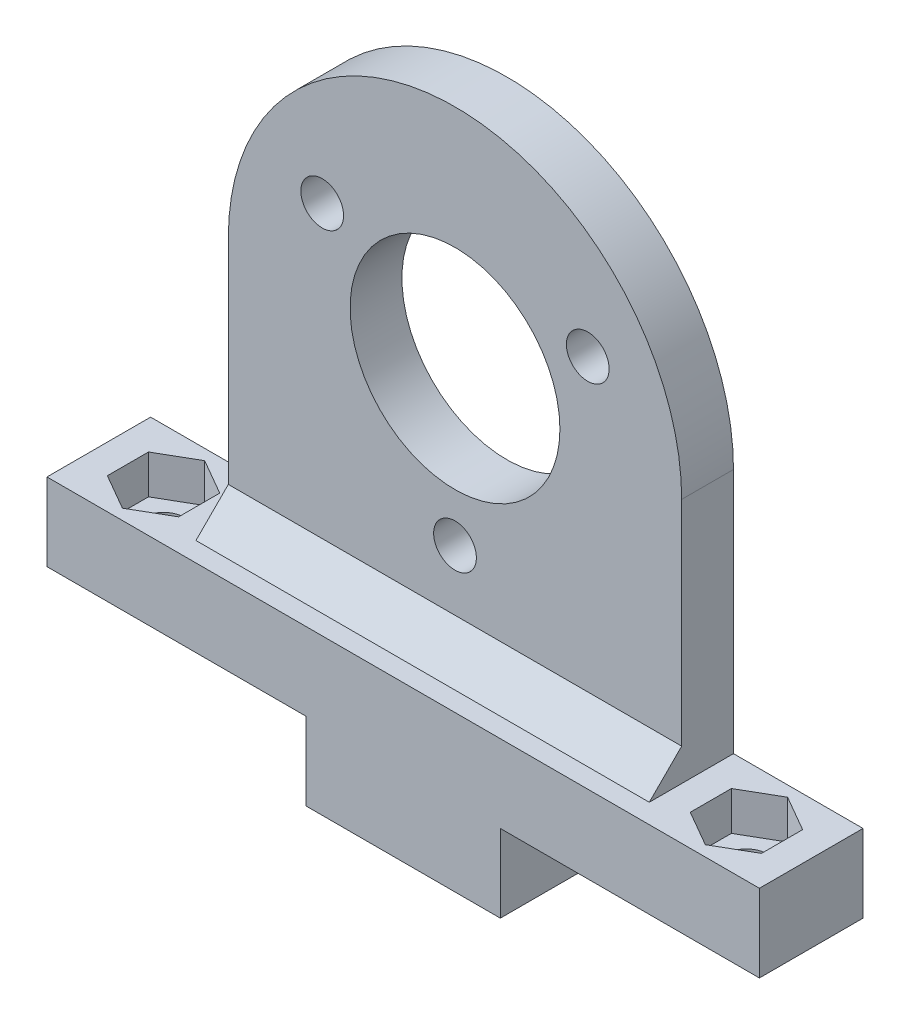
ISO-10303-21;
HEADER;
FILE_DESCRIPTION(('STEP AP214'),'2;1');
FILE_NAME('part.step','',(''),(''),'','','');
FILE_SCHEMA(('AUTOMOTIVE_DESIGN { 1 0 10303 214 1 1 1 1 }'));
ENDSEC;
DATA;
#1=APPLICATION_CONTEXT('core data for automotive mechanical design processes');
#2=APPLICATION_PROTOCOL_DEFINITION('international standard','automotive_design',2000,#1);
#3=PRODUCT_CONTEXT('',#1,'mechanical');
#4=PRODUCT('Part','Part','',(#3));
#5=PRODUCT_RELATED_PRODUCT_CATEGORY('part','',(#4));
#6=PRODUCT_DEFINITION_FORMATION('','',#4);
#7=PRODUCT_DEFINITION_CONTEXT('part definition',#1,'design');
#8=PRODUCT_DEFINITION('design','',#6,#7);
#9=PRODUCT_DEFINITION_SHAPE('','',#8);
#10=(LENGTH_UNIT() NAMED_UNIT(*) SI_UNIT(.MILLI.,.METRE.));
#11=(NAMED_UNIT(*) PLANE_ANGLE_UNIT() SI_UNIT($,.RADIAN.));
#12=(NAMED_UNIT(*) SI_UNIT($,.STERADIAN.) SOLID_ANGLE_UNIT());
#13=UNCERTAINTY_MEASURE_WITH_UNIT(LENGTH_MEASURE(1.E-05),#10,'distance_accuracy_value','');
#14=(GEOMETRIC_REPRESENTATION_CONTEXT(3) GLOBAL_UNCERTAINTY_ASSIGNED_CONTEXT((#13)) GLOBAL_UNIT_ASSIGNED_CONTEXT((#10,
#11,#12)) REPRESENTATION_CONTEXT('',''));
#15=CARTESIAN_POINT('',(0.,0.,0.));
#16=DIRECTION('',(0.,0.,1.));
#17=DIRECTION('',(1.,0.,0.));
#18=AXIS2_PLACEMENT_3D('',#15,#16,#17);
#19=CARTESIAN_POINT('',(0.,0.,4.));
#20=DIRECTION('',(0.,0.,-1.));
#21=DIRECTION('',(-1.,0.,0.));
#22=AXIS2_PLACEMENT_3D('',#19,#20,#21);
#23=PLANE('',#22);
#24=CARTESIAN_POINT('',(7.96238075473354E-13,-11.8356805183879,4.));
#25=DIRECTION('',(0.,0.,1.));
#26=DIRECTION('',(1.,0.,0.));
#27=AXIS2_PLACEMENT_3D('',#24,#25,#26);
#28=CIRCLE('',#27,1.65);
#29=CARTESIAN_POINT('',(1.6500000000008,-11.8356805183879,4.));
#30=VERTEX_POINT('',#29);
#31=EDGE_CURVE('E332',#30,#30,#28,.T.);
#32=ORIENTED_EDGE('',*,*,#31,.F.);
#33=EDGE_LOOP('',(#32));
#34=FACE_BOUND('',#33,.T.);
#35=CARTESIAN_POINT('',(-10.2500000000001,5.91784025919367,4.));
#36=DIRECTION('',(0.,0.,1.));
#37=DIRECTION('',(1.,0.,0.));
#38=AXIS2_PLACEMENT_3D('',#35,#36,#37);
#39=CIRCLE('',#38,1.65000000000001);
#40=CARTESIAN_POINT('',(-8.60000000000008,5.91784025919367,4.));
#41=VERTEX_POINT('',#40);
#42=EDGE_CURVE('E344',#41,#41,#39,.T.);
#43=ORIENTED_EDGE('',*,*,#42,.F.);
#44=EDGE_LOOP('',(#43));
#45=FACE_BOUND('',#44,.T.);
#46=CARTESIAN_POINT('',(0.,0.,4.));
#47=DIRECTION('',(0.,0.,1.));
#48=DIRECTION('',(1.,0.,0.));
#49=AXIS2_PLACEMENT_3D('',#46,#47,#48);
#50=CIRCLE('',#49,8.1);
#51=CARTESIAN_POINT('',(8.1,0.,4.));
#52=VERTEX_POINT('',#51);
#53=EDGE_CURVE('E350',#52,#52,#50,.T.);
#54=ORIENTED_EDGE('',*,*,#53,.F.);
#55=EDGE_LOOP('',(#54));
#56=FACE_BOUND('',#55,.T.);
#57=CARTESIAN_POINT('',(10.2500000000008,5.91784025919418,4.));
#58=DIRECTION('',(0.,0.,1.));
#59=DIRECTION('',(1.,0.,0.));
#60=AXIS2_PLACEMENT_3D('',#57,#58,#59);
#61=CIRCLE('',#60,1.65);
#62=CARTESIAN_POINT('',(11.9000000000008,5.91784025919418,4.));
#63=VERTEX_POINT('',#62);
#64=EDGE_CURVE('E338',#63,#63,#61,.T.);
#65=ORIENTED_EDGE('',*,*,#64,.F.);
#66=EDGE_LOOP('',(#65));
#67=FACE_BOUND('',#66,.T.);
#68=DIRECTION('',(0.,-1.,0.));
#69=VECTOR('',#68,1.);
#70=CARTESIAN_POINT('',(-17.5,0.,4.));
#71=LINE('',#70,#69);
#72=CARTESIAN_POINT('',(-17.5,0.,4.));
#73=VERTEX_POINT('',#72);
#74=CARTESIAN_POINT('',(-17.5,-16.5,4.));
#75=VERTEX_POINT('',#74);
#76=EDGE_CURVE('E358',#73,#75,#71,.T.);
#77=ORIENTED_EDGE('',*,*,#76,.T.);
#78=DIRECTION('',(1.,0.,0.));
#79=VECTOR('',#78,1.);
#80=CARTESIAN_POINT('',(17.5,-16.5,4.));
#81=LINE('',#80,#79);
#82=CARTESIAN_POINT('',(17.5,-16.5,4.));
#83=VERTEX_POINT('',#82);
#84=EDGE_CURVE('E433',#75,#83,#81,.T.);
#85=ORIENTED_EDGE('',*,*,#84,.T.);
#86=DIRECTION('',(0.,1.,0.));
#87=VECTOR('',#86,1.);
#88=CARTESIAN_POINT('',(17.5,0.,4.));
#89=LINE('',#88,#87);
#90=CARTESIAN_POINT('',(17.5,0.,4.));
#91=VERTEX_POINT('',#90);
#92=EDGE_CURVE('E359',#83,#91,#89,.T.);
#93=ORIENTED_EDGE('',*,*,#92,.T.);
#94=CARTESIAN_POINT('',(0.,0.,4.));
#95=DIRECTION('',(0.,0.,1.));
#96=DIRECTION('',(-1.,0.,0.));
#97=AXIS2_PLACEMENT_3D('',#94,#95,#96);
#98=CIRCLE('',#97,17.5);
#99=EDGE_CURVE('E356',#91,#73,#98,.T.);
#100=ORIENTED_EDGE('',*,*,#99,.T.);
#101=EDGE_LOOP('',(#77,#85,#93,#100));
#102=FACE_BOUND('',#101,.T.);
#103=ADVANCED_FACE('F35',(#34,#45,#56,#67,#102),#23,.F.);
#104=CARTESIAN_POINT('',(0.,0.,0.));
#105=DIRECTION('',(0.,0.,-1.));
#106=DIRECTION('',(-1.,0.,0.));
#107=AXIS2_PLACEMENT_3D('',#104,#105,#106);
#108=PLANE('',#107);
#109=CARTESIAN_POINT('',(10.2500000000008,5.91784025919418,0.));
#110=DIRECTION('',(0.,0.,1.));
#111=DIRECTION('',(1.,0.,0.));
#112=AXIS2_PLACEMENT_3D('',#109,#110,#111);
#113=CIRCLE('',#112,1.65);
#114=CARTESIAN_POINT('',(11.9000000000008,5.91784025919418,0.));
#115=VERTEX_POINT('',#114);
#116=EDGE_CURVE('E335',#115,#115,#113,.T.);
#117=ORIENTED_EDGE('',*,*,#116,.T.);
#118=EDGE_LOOP('',(#117));
#119=FACE_BOUND('',#118,.T.);
#120=CARTESIAN_POINT('',(0.,0.,0.));
#121=DIRECTION('',(0.,0.,1.));
#122=DIRECTION('',(1.,0.,0.));
#123=AXIS2_PLACEMENT_3D('',#120,#121,#122);
#124=CIRCLE('',#123,8.1);
#125=CARTESIAN_POINT('',(8.1,0.,0.));
#126=VERTEX_POINT('',#125);
#127=EDGE_CURVE('E347',#126,#126,#124,.T.);
#128=ORIENTED_EDGE('',*,*,#127,.T.);
#129=EDGE_LOOP('',(#128));
#130=FACE_BOUND('',#129,.T.);
#131=DIRECTION('',(-1.,0.,0.));
#132=VECTOR('',#131,1.);
#133=CARTESIAN_POINT('',(-17.5,-19.,0.));
#134=LINE('',#133,#132);
#135=CARTESIAN_POINT('',(-17.5,-19.,0.));
#136=VERTEX_POINT('',#135);
#137=CARTESIAN_POINT('',(-27.5,-19.,0.));
#138=VERTEX_POINT('',#137);
#139=EDGE_CURVE('E353',#136,#138,#134,.T.);
#140=ORIENTED_EDGE('',*,*,#139,.F.);
#141=DIRECTION('',(0.,-1.,0.));
#142=VECTOR('',#141,1.);
#143=CARTESIAN_POINT('',(-17.5,0.,0.));
#144=LINE('',#143,#142);
#145=CARTESIAN_POINT('',(-17.5,0.,0.));
#146=VERTEX_POINT('',#145);
#147=EDGE_CURVE('E382',#146,#136,#144,.T.);
#148=ORIENTED_EDGE('',*,*,#147,.F.);
#149=CARTESIAN_POINT('',(0.,0.,0.));
#150=DIRECTION('',(0.,0.,1.));
#151=DIRECTION('',(-1.,0.,0.));
#152=AXIS2_PLACEMENT_3D('',#149,#150,#151);
#153=CIRCLE('',#152,17.5);
#154=CARTESIAN_POINT('',(17.5,0.,0.));
#155=VERTEX_POINT('',#154);
#156=EDGE_CURVE('E380',#155,#146,#153,.T.);
#157=ORIENTED_EDGE('',*,*,#156,.F.);
#158=DIRECTION('',(0.,1.,0.));
#159=VECTOR('',#158,1.);
#160=CARTESIAN_POINT('',(17.5,0.,0.));
#161=LINE('',#160,#159);
#162=CARTESIAN_POINT('',(17.5,-19.,0.));
#163=VERTEX_POINT('',#162);
#164=EDGE_CURVE('E378',#163,#155,#161,.T.);
#165=ORIENTED_EDGE('',*,*,#164,.F.);
#166=DIRECTION('',(-1.,0.,0.));
#167=VECTOR('',#166,1.);
#168=CARTESIAN_POINT('',(17.5,-19.,0.));
#169=LINE('',#168,#167);
#170=CARTESIAN_POINT('',(27.5,-19.,0.));
#171=VERTEX_POINT('',#170);
#172=EDGE_CURVE('E376',#171,#163,#169,.T.);
#173=ORIENTED_EDGE('',*,*,#172,.F.);
#174=DIRECTION('',(0.,1.,0.));
#175=VECTOR('',#174,1.);
#176=CARTESIAN_POINT('',(27.5,-25.,0.));
#177=LINE('',#176,#175);
#178=CARTESIAN_POINT('',(27.5,-25.,0.));
#179=VERTEX_POINT('',#178);
#180=EDGE_CURVE('E374',#179,#171,#177,.T.);
#181=ORIENTED_EDGE('',*,*,#180,.F.);
#182=DIRECTION('',(1.,0.,0.));
#183=VECTOR('',#182,1.);
#184=CARTESIAN_POINT('',(7.5,-25.,0.));
#185=LINE('',#184,#183);
#186=CARTESIAN_POINT('',(7.5,-25.,0.));
#187=VERTEX_POINT('',#186);
#188=EDGE_CURVE('E372',#187,#179,#185,.T.);
#189=ORIENTED_EDGE('',*,*,#188,.F.);
#190=DIRECTION('',(0.,1.,0.));
#191=VECTOR('',#190,1.);
#192=CARTESIAN_POINT('',(7.5,-31.,0.));
#193=LINE('',#192,#191);
#194=CARTESIAN_POINT('',(7.5,-31.,0.));
#195=VERTEX_POINT('',#194);
#196=EDGE_CURVE('E370',#195,#187,#193,.T.);
#197=ORIENTED_EDGE('',*,*,#196,.F.);
#198=DIRECTION('',(1.,0.,0.));
#199=VECTOR('',#198,1.);
#200=CARTESIAN_POINT('',(-7.5,-31.,0.));
#201=LINE('',#200,#199);
#202=CARTESIAN_POINT('',(-7.5,-31.,0.));
#203=VERTEX_POINT('',#202);
#204=EDGE_CURVE('E368',#203,#195,#201,.T.);
#205=ORIENTED_EDGE('',*,*,#204,.F.);
#206=DIRECTION('',(0.,-1.,0.));
#207=VECTOR('',#206,1.);
#208=CARTESIAN_POINT('',(-7.5,-25.,0.));
#209=LINE('',#208,#207);
#210=CARTESIAN_POINT('',(-7.5,-25.,0.));
#211=VERTEX_POINT('',#210);
#212=EDGE_CURVE('E366',#211,#203,#209,.T.);
#213=ORIENTED_EDGE('',*,*,#212,.F.);
#214=DIRECTION('',(1.,0.,0.));
#215=VECTOR('',#214,1.);
#216=CARTESIAN_POINT('',(-27.5,-25.,0.));
#217=LINE('',#216,#215);
#218=CARTESIAN_POINT('',(-27.5,-25.,0.));
#219=VERTEX_POINT('',#218);
#220=EDGE_CURVE('E364',#219,#211,#217,.T.);
#221=ORIENTED_EDGE('',*,*,#220,.F.);
#222=DIRECTION('',(0.,-1.,0.));
#223=VECTOR('',#222,1.);
#224=CARTESIAN_POINT('',(-27.5,-19.,0.));
#225=LINE('',#224,#223);
#226=EDGE_CURVE('E362',#138,#219,#225,.T.);
#227=ORIENTED_EDGE('',*,*,#226,.F.);
#228=EDGE_LOOP('',(#140,#148,#157,#165,#173,#181,#189,#197,#205,#213,#221,#227));
#229=FACE_BOUND('',#228,.T.);
#230=CARTESIAN_POINT('',(-10.2500000000001,5.91784025919367,0.));
#231=DIRECTION('',(0.,0.,1.));
#232=DIRECTION('',(1.,0.,0.));
#233=AXIS2_PLACEMENT_3D('',#230,#231,#232);
#234=CIRCLE('',#233,1.65000000000001);
#235=CARTESIAN_POINT('',(-8.60000000000008,5.91784025919367,0.));
#236=VERTEX_POINT('',#235);
#237=EDGE_CURVE('E341',#236,#236,#234,.T.);
#238=ORIENTED_EDGE('',*,*,#237,.T.);
#239=EDGE_LOOP('',(#238));
#240=FACE_BOUND('',#239,.T.);
#241=CARTESIAN_POINT('',(7.96238075473354E-13,-11.8356805183879,0.));
#242=DIRECTION('',(0.,0.,1.));
#243=DIRECTION('',(1.,0.,0.));
#244=AXIS2_PLACEMENT_3D('',#241,#242,#243);
#245=CIRCLE('',#244,1.65);
#246=CARTESIAN_POINT('',(1.6500000000008,-11.8356805183879,0.));
#247=VERTEX_POINT('',#246);
#248=EDGE_CURVE('E331',#247,#247,#245,.T.);
#249=ORIENTED_EDGE('',*,*,#248,.T.);
#250=EDGE_LOOP('',(#249));
#251=FACE_BOUND('',#250,.T.);
#252=ADVANCED_FACE('F458',(#119,#130,#229,#240,#251),#108,.T.);
#253=CARTESIAN_POINT('',(-27.5,-19.,4.));
#254=DIRECTION('',(1.,0.,0.));
#255=DIRECTION('',(0.,0.,-1.));
#256=AXIS2_PLACEMENT_3D('',#253,#254,#255);
#257=PLANE('',#256);
#258=ORIENTED_EDGE('',*,*,#226,.T.);
#259=DIRECTION('',(0.,0.,-1.));
#260=VECTOR('',#259,1.);
#261=CARTESIAN_POINT('',(-27.5,-25.,4.));
#262=LINE('',#261,#260);
#263=CARTESIAN_POINT('',(-27.5,-25.,8.));
#264=VERTEX_POINT('',#263);
#265=EDGE_CURVE('E410',#264,#219,#262,.T.);
#266=ORIENTED_EDGE('',*,*,#265,.F.);
#267=DIRECTION('',(0.,-1.,0.));
#268=VECTOR('',#267,1.);
#269=CARTESIAN_POINT('',(-27.5,-25.,8.));
#270=LINE('',#269,#268);
#271=CARTESIAN_POINT('',(-27.5,-19.,8.));
#272=VERTEX_POINT('',#271);
#273=EDGE_CURVE('E298',#272,#264,#270,.T.);
#274=ORIENTED_EDGE('',*,*,#273,.F.);
#275=DIRECTION('',(0.,0.,-1.));
#276=VECTOR('',#275,1.);
#277=CARTESIAN_POINT('',(-27.5,-19.,4.));
#278=LINE('',#277,#276);
#279=EDGE_CURVE('E413',#272,#138,#278,.T.);
#280=ORIENTED_EDGE('',*,*,#279,.T.);
#281=EDGE_LOOP('',(#258,#266,#274,#280));
#282=FACE_BOUND('',#281,.T.);
#283=ADVANCED_FACE('F464',(#282),#257,.F.);
#284=CARTESIAN_POINT('',(-27.5,-25.,4.));
#285=DIRECTION('',(0.,1.,0.));
#286=DIRECTION('',(0.,0.,1.));
#287=AXIS2_PLACEMENT_3D('',#284,#285,#286);
#288=PLANE('',#287);
#289=CARTESIAN_POINT('',(-22.5,-25.,4.));
#290=DIRECTION('',(0.,1.,0.));
#291=DIRECTION('',(0.,0.,1.));
#292=AXIS2_PLACEMENT_3D('',#289,#290,#291);
#293=CIRCLE('',#292,1.6);
#294=CARTESIAN_POINT('',(-22.5,-25.,5.6));
#295=VERTEX_POINT('',#294);
#296=EDGE_CURVE('E231',#295,#295,#293,.T.);
#297=ORIENTED_EDGE('',*,*,#296,.T.);
#298=EDGE_LOOP('',(#297));
#299=FACE_BOUND('',#298,.T.);
#300=ORIENTED_EDGE('',*,*,#220,.T.);
#301=DIRECTION('',(0.,0.,-1.));
#302=VECTOR('',#301,1.);
#303=CARTESIAN_POINT('',(-7.5,-25.,4.));
#304=LINE('',#303,#302);
#305=CARTESIAN_POINT('',(-7.5,-25.,8.));
#306=VERTEX_POINT('',#305);
#307=EDGE_CURVE('E407',#306,#211,#304,.T.);
#308=ORIENTED_EDGE('',*,*,#307,.F.);
#309=DIRECTION('',(1.,0.,0.));
#310=VECTOR('',#309,1.);
#311=CARTESIAN_POINT('',(-27.5,-25.,8.));
#312=LINE('',#311,#310);
#313=EDGE_CURVE('E310',#264,#306,#312,.T.);
#314=ORIENTED_EDGE('',*,*,#313,.F.);
#315=ORIENTED_EDGE('',*,*,#265,.T.);
#316=EDGE_LOOP('',(#300,#308,#314,#315));
#317=FACE_BOUND('',#316,.T.);
#318=ADVANCED_FACE('F507',(#299,#317),#288,.F.);
#319=CARTESIAN_POINT('',(-7.5,-25.,4.));
#320=DIRECTION('',(1.,0.,0.));
#321=DIRECTION('',(0.,0.,-1.));
#322=AXIS2_PLACEMENT_3D('',#319,#320,#321);
#323=PLANE('',#322);
#324=ORIENTED_EDGE('',*,*,#212,.T.);
#325=DIRECTION('',(0.,0.,-1.));
#326=VECTOR('',#325,1.);
#327=CARTESIAN_POINT('',(-7.5,-31.,4.));
#328=LINE('',#327,#326);
#329=CARTESIAN_POINT('',(-7.5,-31.,8.));
#330=VERTEX_POINT('',#329);
#331=EDGE_CURVE('E404',#330,#203,#328,.T.);
#332=ORIENTED_EDGE('',*,*,#331,.F.);
#333=DIRECTION('',(0.,-1.,0.));
#334=VECTOR('',#333,1.);
#335=CARTESIAN_POINT('',(-7.5,-25.,8.));
#336=LINE('',#335,#334);
#337=EDGE_CURVE('E313',#306,#330,#336,.T.);
#338=ORIENTED_EDGE('',*,*,#337,.F.);
#339=ORIENTED_EDGE('',*,*,#307,.T.);
#340=EDGE_LOOP('',(#324,#332,#338,#339));
#341=FACE_BOUND('',#340,.T.);
#342=ADVANCED_FACE('F503',(#341),#323,.F.);
#343=CARTESIAN_POINT('',(-7.5,-31.,4.));
#344=DIRECTION('',(0.,1.,0.));
#345=DIRECTION('',(0.,0.,1.));
#346=AXIS2_PLACEMENT_3D('',#343,#344,#345);
#347=PLANE('',#346);
#348=ORIENTED_EDGE('',*,*,#204,.T.);
#349=DIRECTION('',(0.,0.,-1.));
#350=VECTOR('',#349,1.);
#351=CARTESIAN_POINT('',(7.5,-31.,4.));
#352=LINE('',#351,#350);
#353=CARTESIAN_POINT('',(7.5,-31.,8.));
#354=VERTEX_POINT('',#353);
#355=EDGE_CURVE('E401',#354,#195,#352,.T.);
#356=ORIENTED_EDGE('',*,*,#355,.F.);
#357=DIRECTION('',(1.,0.,0.));
#358=VECTOR('',#357,1.);
#359=CARTESIAN_POINT('',(-7.5,-31.,8.));
#360=LINE('',#359,#358);
#361=EDGE_CURVE('E316',#330,#354,#360,.T.);
#362=ORIENTED_EDGE('',*,*,#361,.F.);
#363=ORIENTED_EDGE('',*,*,#331,.T.);
#364=EDGE_LOOP('',(#348,#356,#362,#363));
#365=FACE_BOUND('',#364,.T.);
#366=ADVANCED_FACE('F499',(#365),#347,.F.);
#367=CARTESIAN_POINT('',(7.5,-31.,4.));
#368=DIRECTION('',(-1.,0.,0.));
#369=DIRECTION('',(0.,0.,1.));
#370=AXIS2_PLACEMENT_3D('',#367,#368,#369);
#371=PLANE('',#370);
#372=ORIENTED_EDGE('',*,*,#196,.T.);
#373=DIRECTION('',(0.,0.,-1.));
#374=VECTOR('',#373,1.);
#375=CARTESIAN_POINT('',(7.5,-25.,4.));
#376=LINE('',#375,#374);
#377=CARTESIAN_POINT('',(7.5,-25.,8.));
#378=VERTEX_POINT('',#377);
#379=EDGE_CURVE('E398',#378,#187,#376,.T.);
#380=ORIENTED_EDGE('',*,*,#379,.F.);
#381=DIRECTION('',(0.,1.,0.));
#382=VECTOR('',#381,1.);
#383=CARTESIAN_POINT('',(7.5,-31.,8.));
#384=LINE('',#383,#382);
#385=EDGE_CURVE('E319',#354,#378,#384,.T.);
#386=ORIENTED_EDGE('',*,*,#385,.F.);
#387=ORIENTED_EDGE('',*,*,#355,.T.);
#388=EDGE_LOOP('',(#372,#380,#386,#387));
#389=FACE_BOUND('',#388,.T.);
#390=ADVANCED_FACE('F496',(#389),#371,.F.);
#391=CARTESIAN_POINT('',(7.5,-25.,4.));
#392=DIRECTION('',(0.,1.,0.));
#393=DIRECTION('',(-1.,0.,0.));
#394=AXIS2_PLACEMENT_3D('',#391,#392,#393);
#395=PLANE('',#394);
#396=CARTESIAN_POINT('',(22.5,-25.,3.99999999999998));
#397=DIRECTION('',(0.,1.,0.));
#398=DIRECTION('',(-1.,0.,0.));
#399=AXIS2_PLACEMENT_3D('',#396,#397,#398);
#400=CIRCLE('',#399,1.6);
#401=CARTESIAN_POINT('',(20.9,-25.,3.99999999999998));
#402=VERTEX_POINT('',#401);
#403=EDGE_CURVE('E437',#402,#402,#400,.T.);
#404=ORIENTED_EDGE('',*,*,#403,.T.);
#405=EDGE_LOOP('',(#404));
#406=FACE_BOUND('',#405,.T.);
#407=ORIENTED_EDGE('',*,*,#188,.T.);
#408=DIRECTION('',(0.,0.,-1.));
#409=VECTOR('',#408,1.);
#410=CARTESIAN_POINT('',(27.5,-25.,4.));
#411=LINE('',#410,#409);
#412=CARTESIAN_POINT('',(27.5,-25.,8.));
#413=VERTEX_POINT('',#412);
#414=EDGE_CURVE('E395',#413,#179,#411,.T.);
#415=ORIENTED_EDGE('',*,*,#414,.F.);
#416=DIRECTION('',(1.,0.,0.));
#417=VECTOR('',#416,1.);
#418=CARTESIAN_POINT('',(7.5,-25.,8.));
#419=LINE('',#418,#417);
#420=EDGE_CURVE('E322',#378,#413,#419,.T.);
#421=ORIENTED_EDGE('',*,*,#420,.F.);
#422=ORIENTED_EDGE('',*,*,#379,.T.);
#423=EDGE_LOOP('',(#407,#415,#421,#422));
#424=FACE_BOUND('',#423,.T.);
#425=ADVANCED_FACE('F492',(#406,#424),#395,.F.);
#426=CARTESIAN_POINT('',(27.5,-25.,4.));
#427=DIRECTION('',(-1.,0.,0.));
#428=DIRECTION('',(0.,0.,1.));
#429=AXIS2_PLACEMENT_3D('',#426,#427,#428);
#430=PLANE('',#429);
#431=ORIENTED_EDGE('',*,*,#180,.T.);
#432=DIRECTION('',(0.,0.,-1.));
#433=VECTOR('',#432,1.);
#434=CARTESIAN_POINT('',(27.5,-19.,4.));
#435=LINE('',#434,#433);
#436=CARTESIAN_POINT('',(27.5,-19.,8.));
#437=VERTEX_POINT('',#436);
#438=EDGE_CURVE('E392',#437,#171,#435,.T.);
#439=ORIENTED_EDGE('',*,*,#438,.F.);
#440=DIRECTION('',(0.,1.,0.));
#441=VECTOR('',#440,1.);
#442=CARTESIAN_POINT('',(27.5,-25.,8.));
#443=LINE('',#442,#441);
#444=EDGE_CURVE('E325',#413,#437,#443,.T.);
#445=ORIENTED_EDGE('',*,*,#444,.F.);
#446=ORIENTED_EDGE('',*,*,#414,.T.);
#447=EDGE_LOOP('',(#431,#439,#445,#446));
#448=FACE_BOUND('',#447,.T.);
#449=ADVANCED_FACE('F488',(#448),#430,.F.);
#450=CARTESIAN_POINT('',(17.5,-19.,4.));
#451=DIRECTION('',(0.,-1.,0.));
#452=DIRECTION('',(0.,0.,-1.));
#453=AXIS2_PLACEMENT_3D('',#450,#451,#452);
#454=PLANE('',#453);
#455=DIRECTION('',(0.866025403784441,0.,0.499999999999996));
#456=VECTOR('',#455,1.);
#457=CARTESIAN_POINT('',(22.5,-19.,7.17542648054286));
#458=LINE('',#457,#456);
#459=CARTESIAN_POINT('',(19.75,-19.,5.58771324027139));
#460=VERTEX_POINT('',#459);
#461=CARTESIAN_POINT('',(22.5,-19.,7.17542648054286));
#462=VERTEX_POINT('',#461);
#463=EDGE_CURVE('E242',#460,#462,#458,.T.);
#464=ORIENTED_EDGE('',*,*,#463,.F.);
#465=DIRECTION('',(0.,0.,1.));
#466=VECTOR('',#465,1.);
#467=CARTESIAN_POINT('',(19.75,-19.,5.58771324027139));
#468=LINE('',#467,#466);
#469=CARTESIAN_POINT('',(19.75,-19.,2.41228675972844));
#470=VERTEX_POINT('',#469);
#471=EDGE_CURVE('E52',#470,#460,#468,.T.);
#472=ORIENTED_EDGE('',*,*,#471,.F.);
#473=DIRECTION('',(-0.866025403784436,0.,0.500000000000004));
#474=VECTOR('',#473,1.);
#475=CARTESIAN_POINT('',(19.75,-19.,2.41228675972844));
#476=LINE('',#475,#474);
#477=CARTESIAN_POINT('',(22.5,-19.,0.82457351945695));
#478=VERTEX_POINT('',#477);
#479=EDGE_CURVE('E225',#478,#470,#476,.T.);
#480=ORIENTED_EDGE('',*,*,#479,.F.);
#481=DIRECTION('',(-0.866025403784441,0.,-0.499999999999996));
#482=VECTOR('',#481,1.);
#483=CARTESIAN_POINT('',(22.5,-19.,0.82457351945695));
#484=LINE('',#483,#482);
#485=CARTESIAN_POINT('',(25.25,-19.,2.41228675972841));
#486=VERTEX_POINT('',#485);
#487=EDGE_CURVE('E228',#486,#478,#484,.T.);
#488=ORIENTED_EDGE('',*,*,#487,.F.);
#489=DIRECTION('',(0.,0.,-1.));
#490=VECTOR('',#489,1.);
#491=CARTESIAN_POINT('',(25.25,-19.,2.41228675972841));
#492=LINE('',#491,#490);
#493=CARTESIAN_POINT('',(25.25,-19.,5.58771324027137));
#494=VERTEX_POINT('',#493);
#495=EDGE_CURVE('E247',#494,#486,#492,.T.);
#496=ORIENTED_EDGE('',*,*,#495,.F.);
#497=DIRECTION('',(0.866025403784436,0.,-0.500000000000004));
#498=VECTOR('',#497,1.);
#499=CARTESIAN_POINT('',(25.25,-19.,5.58771324027137));
#500=LINE('',#499,#498);
#501=EDGE_CURVE('E244',#462,#494,#500,.T.);
#502=ORIENTED_EDGE('',*,*,#501,.F.);
#503=EDGE_LOOP('',(#464,#472,#480,#488,#496,#502));
#504=FACE_BOUND('',#503,.T.);
#505=DIRECTION('',(-0.866025403784439,0.,0.5));
#506=VECTOR('',#505,1.);
#507=CARTESIAN_POINT('',(-22.5,-19.,0.824573519457044));
#508=LINE('',#507,#506);
#509=CARTESIAN_POINT('',(-22.5,-19.,0.824573519457042));
#510=VERTEX_POINT('',#509);
#511=CARTESIAN_POINT('',(-25.25,-19.,2.41228675972852));
#512=VERTEX_POINT('',#511);
#513=EDGE_CURVE('E282',#510,#512,#508,.T.);
#514=ORIENTED_EDGE('',*,*,#513,.F.);
#515=DIRECTION('',(-0.866025403784439,0.,-0.5));
#516=VECTOR('',#515,1.);
#517=CARTESIAN_POINT('',(-19.75,-19.,2.41228675972852));
#518=LINE('',#517,#516);
#519=CARTESIAN_POINT('',(-19.75,-19.,2.41228675972852));
#520=VERTEX_POINT('',#519);
#521=EDGE_CURVE('E60',#520,#510,#518,.T.);
#522=ORIENTED_EDGE('',*,*,#521,.F.);
#523=DIRECTION('',(0.,0.,-1.));
#524=VECTOR('',#523,1.);
#525=CARTESIAN_POINT('',(-19.75,-19.,5.58771324027148));
#526=LINE('',#525,#524);
#527=CARTESIAN_POINT('',(-19.75,-19.,5.58771324027148));
#528=VERTEX_POINT('',#527);
#529=EDGE_CURVE('E265',#528,#520,#526,.T.);
#530=ORIENTED_EDGE('',*,*,#529,.F.);
#531=DIRECTION('',(0.866025403784439,0.,-0.5));
#532=VECTOR('',#531,1.);
#533=CARTESIAN_POINT('',(-22.5,-19.,7.17542648054295));
#534=LINE('',#533,#532);
#535=CARTESIAN_POINT('',(-22.5,-19.,7.17542648054295));
#536=VERTEX_POINT('',#535);
#537=EDGE_CURVE('E291',#536,#528,#534,.T.);
#538=ORIENTED_EDGE('',*,*,#537,.F.);
#539=DIRECTION('',(0.866025403784439,0.,0.5));
#540=VECTOR('',#539,1.);
#541=CARTESIAN_POINT('',(-25.25,-19.,5.58771324027147));
#542=LINE('',#541,#540);
#543=CARTESIAN_POINT('',(-25.25,-19.,5.58771324027147));
#544=VERTEX_POINT('',#543);
#545=EDGE_CURVE('E288',#544,#536,#542,.T.);
#546=ORIENTED_EDGE('',*,*,#545,.F.);
#547=DIRECTION('',(0.,0.,1.));
#548=VECTOR('',#547,1.);
#549=CARTESIAN_POINT('',(-25.25,-19.,2.41228675972852));
#550=LINE('',#549,#548);
#551=EDGE_CURVE('E285',#512,#544,#550,.T.);
#552=ORIENTED_EDGE('',*,*,#551,.F.);
#553=EDGE_LOOP('',(#514,#522,#530,#538,#546,#552));
#554=FACE_BOUND('',#553,.T.);
#555=DIRECTION('',(-1.,0.,0.));
#556=VECTOR('',#555,1.);
#557=CARTESIAN_POINT('',(-17.5,-19.,6.50000000000003));
#558=LINE('',#557,#556);
#559=CARTESIAN_POINT('',(17.5,-19.,6.50000000000003));
#560=VERTEX_POINT('',#559);
#561=CARTESIAN_POINT('',(-17.5,-19.,6.50000000000003));
#562=VERTEX_POINT('',#561);
#563=EDGE_CURVE('E416',#560,#562,#558,.T.);
#564=ORIENTED_EDGE('',*,*,#563,.T.);
#565=DIRECTION('',(0.,0.,-1.));
#566=VECTOR('',#565,1.);
#567=CARTESIAN_POINT('',(-17.5,-19.,4.));
#568=LINE('',#567,#566);
#569=EDGE_CURVE('E388',#562,#136,#568,.T.);
#570=ORIENTED_EDGE('',*,*,#569,.T.);
#571=ORIENTED_EDGE('',*,*,#139,.T.);
#572=ORIENTED_EDGE('',*,*,#279,.F.);
#573=DIRECTION('',(-1.,0.,0.));
#574=VECTOR('',#573,1.);
#575=CARTESIAN_POINT('',(-27.5,-19.,8.));
#576=LINE('',#575,#574);
#577=EDGE_CURVE('E328',#437,#272,#576,.T.);
#578=ORIENTED_EDGE('',*,*,#577,.F.);
#579=ORIENTED_EDGE('',*,*,#438,.T.);
#580=ORIENTED_EDGE('',*,*,#172,.T.);
#581=DIRECTION('',(0.,0.,-1.));
#582=VECTOR('',#581,1.);
#583=CARTESIAN_POINT('',(17.5,-19.,4.));
#584=LINE('',#583,#582);
#585=EDGE_CURVE('E391',#560,#163,#584,.T.);
#586=ORIENTED_EDGE('',*,*,#585,.F.);
#587=EDGE_LOOP('',(#564,#570,#571,#572,#578,#579,#580,#586));
#588=FACE_BOUND('',#587,.T.);
#589=ADVANCED_FACE('F484',(#504,#554,#588),#454,.F.);
#590=CARTESIAN_POINT('',(17.5,0.,4.));
#591=DIRECTION('',(-1.,0.,0.));
#592=DIRECTION('',(0.,-1.,0.));
#593=AXIS2_PLACEMENT_3D('',#590,#591,#592);
#594=PLANE('',#593);
#595=ORIENTED_EDGE('',*,*,#164,.T.);
#596=DIRECTION('',(0.,0.,-1.));
#597=VECTOR('',#596,1.);
#598=CARTESIAN_POINT('',(17.5,0.,4.));
#599=LINE('',#598,#597);
#600=EDGE_CURVE('E387',#91,#155,#599,.T.);
#601=ORIENTED_EDGE('',*,*,#600,.F.);
#602=ORIENTED_EDGE('',*,*,#92,.F.);
#603=DIRECTION('',(0.,0.707106781186543,-0.707106781186552));
#604=VECTOR('',#603,1.);
#605=CARTESIAN_POINT('',(17.5,-8.25000000000012,-4.25));
#606=LINE('',#605,#604);
#607=EDGE_CURVE('E11',#83,#560,#606,.F.);
#608=ORIENTED_EDGE('',*,*,#607,.T.);
#609=ORIENTED_EDGE('',*,*,#585,.T.);
#610=EDGE_LOOP('',(#595,#601,#602,#608,#609));
#611=FACE_BOUND('',#610,.T.);
#612=ADVANCED_FACE('F480',(#611),#594,.F.);
#613=CARTESIAN_POINT('',(0.,0.,4.));
#614=DIRECTION('',(0.,0.,-1.));
#615=DIRECTION('',(-1.,0.,0.));
#616=AXIS2_PLACEMENT_3D('',#613,#614,#615);
#617=CYLINDRICAL_SURFACE('',#616,17.5);
#618=ORIENTED_EDGE('',*,*,#156,.T.);
#619=DIRECTION('',(0.,0.,-1.));
#620=VECTOR('',#619,1.);
#621=CARTESIAN_POINT('',(-17.5,0.,4.));
#622=LINE('',#621,#620);
#623=EDGE_CURVE('E384',#73,#146,#622,.T.);
#624=ORIENTED_EDGE('',*,*,#623,.F.);
#625=ORIENTED_EDGE('',*,*,#99,.F.);
#626=ORIENTED_EDGE('',*,*,#600,.T.);
#627=EDGE_LOOP('',(#618,#624,#625,#626));
#628=FACE_BOUND('',#627,.T.);
#629=ADVANCED_FACE('F476',(#628),#617,.T.);
#630=CARTESIAN_POINT('',(-17.5,0.,4.));
#631=DIRECTION('',(1.,0.,0.));
#632=DIRECTION('',(0.,1.,0.));
#633=AXIS2_PLACEMENT_3D('',#630,#631,#632);
#634=PLANE('',#633);
#635=ORIENTED_EDGE('',*,*,#147,.T.);
#636=ORIENTED_EDGE('',*,*,#569,.F.);
#637=DIRECTION('',(0.,-0.707106781186543,0.707106781186552));
#638=VECTOR('',#637,1.);
#639=CARTESIAN_POINT('',(-17.5,-8.25000000000012,-4.25));
#640=LINE('',#639,#638);
#641=EDGE_CURVE('E44',#562,#75,#640,.F.);
#642=ORIENTED_EDGE('',*,*,#641,.T.);
#643=ORIENTED_EDGE('',*,*,#76,.F.);
#644=ORIENTED_EDGE('',*,*,#623,.T.);
#645=EDGE_LOOP('',(#635,#636,#642,#643,#644));
#646=FACE_BOUND('',#645,.T.);
#647=ADVANCED_FACE('F473',(#646),#634,.F.);
#648=CARTESIAN_POINT('',(0.,0.,4.));
#649=DIRECTION('',(0.,0.,-1.));
#650=DIRECTION('',(-1.,0.,0.));
#651=AXIS2_PLACEMENT_3D('',#648,#649,#650);
#652=CYLINDRICAL_SURFACE('',#651,8.1);
#653=ORIENTED_EDGE('',*,*,#53,.T.);
#654=EDGE_LOOP('',(#653));
#655=FACE_BOUND('',#654,.T.);
#656=ORIENTED_EDGE('',*,*,#127,.F.);
#657=EDGE_LOOP('',(#656));
#658=FACE_BOUND('',#657,.T.);
#659=ADVANCED_FACE('F470',(#655,#658),#652,.F.);
#660=CARTESIAN_POINT('',(-10.2500000000001,5.91784025919367,4.));
#661=DIRECTION('',(0.,0.,-1.));
#662=DIRECTION('',(-1.,0.,0.));
#663=AXIS2_PLACEMENT_3D('',#660,#661,#662);
#664=CYLINDRICAL_SURFACE('',#663,1.65000000000001);
#665=ORIENTED_EDGE('',*,*,#42,.T.);
#666=EDGE_LOOP('',(#665));
#667=FACE_BOUND('',#666,.T.);
#668=ORIENTED_EDGE('',*,*,#237,.F.);
#669=EDGE_LOOP('',(#668));
#670=FACE_BOUND('',#669,.T.);
#671=ADVANCED_FACE('F572',(#667,#670),#664,.F.);
#672=CARTESIAN_POINT('',(10.2500000000008,5.91784025919418,4.));
#673=DIRECTION('',(0.,0.,-1.));
#674=DIRECTION('',(-1.,0.,0.));
#675=AXIS2_PLACEMENT_3D('',#672,#673,#674);
#676=CYLINDRICAL_SURFACE('',#675,1.65);
#677=ORIENTED_EDGE('',*,*,#64,.T.);
#678=EDGE_LOOP('',(#677));
#679=FACE_BOUND('',#678,.T.);
#680=ORIENTED_EDGE('',*,*,#116,.F.);
#681=EDGE_LOOP('',(#680));
#682=FACE_BOUND('',#681,.T.);
#683=ADVANCED_FACE('F566',(#679,#682),#676,.F.);
#684=CARTESIAN_POINT('',(7.96238075473354E-13,-11.8356805183879,4.));
#685=DIRECTION('',(0.,0.,-1.));
#686=DIRECTION('',(-1.,0.,0.));
#687=AXIS2_PLACEMENT_3D('',#684,#685,#686);
#688=CYLINDRICAL_SURFACE('',#687,1.65);
#689=ORIENTED_EDGE('',*,*,#31,.T.);
#690=EDGE_LOOP('',(#689));
#691=FACE_BOUND('',#690,.T.);
#692=ORIENTED_EDGE('',*,*,#248,.F.);
#693=EDGE_LOOP('',(#692));
#694=FACE_BOUND('',#693,.T.);
#695=ADVANCED_FACE('F561',(#691,#694),#688,.F.);
#696=CARTESIAN_POINT('',(0.,0.,8.));
#697=DIRECTION('',(0.,0.,-1.));
#698=DIRECTION('',(-1.,0.,0.));
#699=AXIS2_PLACEMENT_3D('',#696,#697,#698);
#700=PLANE('',#699);
#701=ORIENTED_EDGE('',*,*,#273,.T.);
#702=ORIENTED_EDGE('',*,*,#313,.T.);
#703=ORIENTED_EDGE('',*,*,#337,.T.);
#704=ORIENTED_EDGE('',*,*,#361,.T.);
#705=ORIENTED_EDGE('',*,*,#385,.T.);
#706=ORIENTED_EDGE('',*,*,#420,.T.);
#707=ORIENTED_EDGE('',*,*,#444,.T.);
#708=ORIENTED_EDGE('',*,*,#577,.T.);
#709=EDGE_LOOP('',(#701,#702,#703,#704,#705,#706,#707,#708));
#710=FACE_BOUND('',#709,.T.);
#711=ADVANCED_FACE('F529',(#710),#700,.F.);
#712=CARTESIAN_POINT('',(17.5,-19.,6.50000000000003));
#713=DIRECTION('',(0.,0.707106781186552,0.707106781186542));
#714=DIRECTION('',(1.,0.,0.));
#715=AXIS2_PLACEMENT_3D('',#712,#713,#714);
#716=PLANE('',#715);
#717=ORIENTED_EDGE('',*,*,#607,.F.);
#718=ORIENTED_EDGE('',*,*,#84,.F.);
#719=ORIENTED_EDGE('',*,*,#641,.F.);
#720=ORIENTED_EDGE('',*,*,#563,.F.);
#721=EDGE_LOOP('',(#717,#718,#719,#720));
#722=FACE_BOUND('',#721,.T.);
#723=ADVANCED_FACE('F37',(#722),#716,.T.);
#724=CARTESIAN_POINT('',(-19.75,-22.,2.41228675972852));
#725=DIRECTION('',(0.5,0.,-0.866025403784439));
#726=DIRECTION('',(-0.866025403784439,0.,-0.5));
#727=AXIS2_PLACEMENT_3D('',#724,#725,#726);
#728=PLANE('',#727);
#729=ORIENTED_EDGE('',*,*,#521,.T.);
#730=DIRECTION('',(0.,1.,0.));
#731=VECTOR('',#730,1.);
#732=CARTESIAN_POINT('',(-22.5,-22.,0.824573519457044));
#733=LINE('',#732,#731);
#734=CARTESIAN_POINT('',(-22.5,-22.,0.824573519457044));
#735=VERTEX_POINT('',#734);
#736=EDGE_CURVE('E280',#735,#510,#733,.T.);
#737=ORIENTED_EDGE('',*,*,#736,.F.);
#738=DIRECTION('',(-0.866025403784439,0.,-0.5));
#739=VECTOR('',#738,1.);
#740=CARTESIAN_POINT('',(-19.75,-22.,2.41228675972852));
#741=LINE('',#740,#739);
#742=CARTESIAN_POINT('',(-19.75,-22.,2.41228675972852));
#743=VERTEX_POINT('',#742);
#744=EDGE_CURVE('E261',#743,#735,#741,.T.);
#745=ORIENTED_EDGE('',*,*,#744,.F.);
#746=DIRECTION('',(0.,1.,0.));
#747=VECTOR('',#746,1.);
#748=CARTESIAN_POINT('',(-19.75,-22.,2.41228675972852));
#749=LINE('',#748,#747);
#750=EDGE_CURVE('E296',#743,#520,#749,.T.);
#751=ORIENTED_EDGE('',*,*,#750,.T.);
#752=EDGE_LOOP('',(#729,#737,#745,#751));
#753=FACE_BOUND('',#752,.T.);
#754=ADVANCED_FACE('F554',(#753),#728,.F.);
#755=CARTESIAN_POINT('',(-19.75,-22.,5.58771324027148));
#756=DIRECTION('',(1.,0.,0.));
#757=DIRECTION('',(0.,1.,0.));
#758=AXIS2_PLACEMENT_3D('',#755,#756,#757);
#759=PLANE('',#758);
#760=ORIENTED_EDGE('',*,*,#529,.T.);
#761=ORIENTED_EDGE('',*,*,#750,.F.);
#762=DIRECTION('',(0.,0.,-1.));
#763=VECTOR('',#762,1.);
#764=CARTESIAN_POINT('',(-19.75,-22.,5.58771324027148));
#765=LINE('',#764,#763);
#766=CARTESIAN_POINT('',(-19.75,-22.,5.58771324027148));
#767=VERTEX_POINT('',#766);
#768=EDGE_CURVE('E277',#767,#743,#765,.T.);
#769=ORIENTED_EDGE('',*,*,#768,.F.);
#770=DIRECTION('',(0.,1.,0.));
#771=VECTOR('',#770,1.);
#772=CARTESIAN_POINT('',(-19.75,-22.,5.58771324027148));
#773=LINE('',#772,#771);
#774=EDGE_CURVE('E299',#767,#528,#773,.T.);
#775=ORIENTED_EDGE('',*,*,#774,.T.);
#776=EDGE_LOOP('',(#760,#761,#769,#775));
#777=FACE_BOUND('',#776,.T.);
#778=ADVANCED_FACE('F559',(#777),#759,.F.);
#779=CARTESIAN_POINT('',(-22.5,-22.,7.17542648054295));
#780=DIRECTION('',(0.5,0.,0.866025403784439));
#781=DIRECTION('',(0.866025403784439,0.,-0.5));
#782=AXIS2_PLACEMENT_3D('',#779,#780,#781);
#783=PLANE('',#782);
#784=ORIENTED_EDGE('',*,*,#537,.T.);
#785=ORIENTED_EDGE('',*,*,#774,.F.);
#786=DIRECTION('',(0.866025403784439,0.,-0.5));
#787=VECTOR('',#786,1.);
#788=CARTESIAN_POINT('',(-22.5,-22.,7.17542648054295));
#789=LINE('',#788,#787);
#790=CARTESIAN_POINT('',(-22.5,-22.,7.17542648054295));
#791=VERTEX_POINT('',#790);
#792=EDGE_CURVE('E274',#791,#767,#789,.T.);
#793=ORIENTED_EDGE('',*,*,#792,.F.);
#794=DIRECTION('',(0.,1.,0.));
#795=VECTOR('',#794,1.);
#796=CARTESIAN_POINT('',(-22.5,-22.,7.17542648054295));
#797=LINE('',#796,#795);
#798=EDGE_CURVE('E301',#791,#536,#797,.T.);
#799=ORIENTED_EDGE('',*,*,#798,.T.);
#800=EDGE_LOOP('',(#784,#785,#793,#799));
#801=FACE_BOUND('',#800,.T.);
#802=ADVANCED_FACE('F732',(#801),#783,.F.);
#803=CARTESIAN_POINT('',(-25.25,-22.,5.58771324027147));
#804=DIRECTION('',(-0.5,0.,0.866025403784439));
#805=DIRECTION('',(0.866025403784439,0.,0.5));
#806=AXIS2_PLACEMENT_3D('',#803,#804,#805);
#807=PLANE('',#806);
#808=ORIENTED_EDGE('',*,*,#545,.T.);
#809=ORIENTED_EDGE('',*,*,#798,.F.);
#810=DIRECTION('',(0.866025403784439,0.,0.5));
#811=VECTOR('',#810,1.);
#812=CARTESIAN_POINT('',(-25.25,-22.,5.58771324027147));
#813=LINE('',#812,#811);
#814=CARTESIAN_POINT('',(-25.25,-22.,5.58771324027147));
#815=VERTEX_POINT('',#814);
#816=EDGE_CURVE('E271',#815,#791,#813,.T.);
#817=ORIENTED_EDGE('',*,*,#816,.F.);
#818=DIRECTION('',(0.,1.,0.));
#819=VECTOR('',#818,1.);
#820=CARTESIAN_POINT('',(-25.25,-22.,5.58771324027147));
#821=LINE('',#820,#819);
#822=EDGE_CURVE('E303',#815,#544,#821,.T.);
#823=ORIENTED_EDGE('',*,*,#822,.T.);
#824=EDGE_LOOP('',(#808,#809,#817,#823));
#825=FACE_BOUND('',#824,.T.);
#826=ADVANCED_FACE('F722',(#825),#807,.F.);
#827=CARTESIAN_POINT('',(-25.25,-22.,2.41228675972852));
#828=DIRECTION('',(-1.,0.,0.));
#829=DIRECTION('',(0.,-1.,0.));
#830=AXIS2_PLACEMENT_3D('',#827,#828,#829);
#831=PLANE('',#830);
#832=ORIENTED_EDGE('',*,*,#551,.T.);
#833=ORIENTED_EDGE('',*,*,#822,.F.);
#834=DIRECTION('',(0.,0.,1.));
#835=VECTOR('',#834,1.);
#836=CARTESIAN_POINT('',(-25.25,-22.,2.41228675972852));
#837=LINE('',#836,#835);
#838=CARTESIAN_POINT('',(-25.25,-22.,2.41228675972852));
#839=VERTEX_POINT('',#838);
#840=EDGE_CURVE('E268',#839,#815,#837,.T.);
#841=ORIENTED_EDGE('',*,*,#840,.F.);
#842=DIRECTION('',(0.,1.,0.));
#843=VECTOR('',#842,1.);
#844=CARTESIAN_POINT('',(-25.25,-22.,2.41228675972852));
#845=LINE('',#844,#843);
#846=EDGE_CURVE('E305',#839,#512,#845,.T.);
#847=ORIENTED_EDGE('',*,*,#846,.T.);
#848=EDGE_LOOP('',(#832,#833,#841,#847));
#849=FACE_BOUND('',#848,.T.);
#850=ADVANCED_FACE('F713',(#849),#831,.F.);
#851=CARTESIAN_POINT('',(-22.5,-22.,0.824573519457044));
#852=DIRECTION('',(-0.5,0.,-0.866025403784439));
#853=DIRECTION('',(-0.866025403784439,0.,0.5));
#854=AXIS2_PLACEMENT_3D('',#851,#852,#853);
#855=PLANE('',#854);
#856=ORIENTED_EDGE('',*,*,#513,.T.);
#857=ORIENTED_EDGE('',*,*,#846,.F.);
#858=DIRECTION('',(-0.866025403784439,0.,0.5));
#859=VECTOR('',#858,1.);
#860=CARTESIAN_POINT('',(-22.5,-22.,0.824573519457044));
#861=LINE('',#860,#859);
#862=EDGE_CURVE('E264',#735,#839,#861,.T.);
#863=ORIENTED_EDGE('',*,*,#862,.F.);
#864=ORIENTED_EDGE('',*,*,#736,.T.);
#865=EDGE_LOOP('',(#856,#857,#863,#864));
#866=FACE_BOUND('',#865,.T.);
#867=ADVANCED_FACE('F708',(#866),#855,.F.);
#868=CARTESIAN_POINT('',(0.,-22.,0.));
#869=DIRECTION('',(0.,1.,0.));
#870=DIRECTION('',(0.,0.,1.));
#871=AXIS2_PLACEMENT_3D('',#868,#869,#870);
#872=PLANE('',#871);
#873=CARTESIAN_POINT('',(-22.5,-22.,4.));
#874=DIRECTION('',(0.,1.,0.));
#875=DIRECTION('',(0.,0.,1.));
#876=AXIS2_PLACEMENT_3D('',#873,#874,#875);
#877=CIRCLE('',#876,1.6);
#878=CARTESIAN_POINT('',(-22.5,-22.,5.6));
#879=VERTEX_POINT('',#878);
#880=EDGE_CURVE('E435',#879,#879,#877,.T.);
#881=ORIENTED_EDGE('',*,*,#880,.F.);
#882=EDGE_LOOP('',(#881));
#883=FACE_BOUND('',#882,.T.);
#884=ORIENTED_EDGE('',*,*,#744,.T.);
#885=ORIENTED_EDGE('',*,*,#862,.T.);
#886=ORIENTED_EDGE('',*,*,#840,.T.);
#887=ORIENTED_EDGE('',*,*,#816,.T.);
#888=ORIENTED_EDGE('',*,*,#792,.T.);
#889=ORIENTED_EDGE('',*,*,#768,.T.);
#890=EDGE_LOOP('',(#884,#885,#886,#887,#888,#889));
#891=FACE_BOUND('',#890,.T.);
#892=ADVANCED_FACE('F701',(#883,#891),#872,.T.);
#893=CARTESIAN_POINT('',(19.75,-22.,5.58771324027139));
#894=DIRECTION('',(-1.,0.,0.));
#895=DIRECTION('',(0.,0.,1.));
#896=AXIS2_PLACEMENT_3D('',#893,#894,#895);
#897=PLANE('',#896);
#898=ORIENTED_EDGE('',*,*,#471,.T.);
#899=DIRECTION('',(0.,1.,0.));
#900=VECTOR('',#899,1.);
#901=CARTESIAN_POINT('',(19.75,-22.,5.58771324027139));
#902=LINE('',#901,#900);
#903=CARTESIAN_POINT('',(19.75,-22.,5.58771324027139));
#904=VERTEX_POINT('',#903);
#905=EDGE_CURVE('E202',#904,#460,#902,.T.);
#906=ORIENTED_EDGE('',*,*,#905,.F.);
#907=DIRECTION('',(0.,0.,1.));
#908=VECTOR('',#907,1.);
#909=CARTESIAN_POINT('',(19.75,-22.,5.58771324027139));
#910=LINE('',#909,#908);
#911=CARTESIAN_POINT('',(19.75,-22.,2.41228675972844));
#912=VERTEX_POINT('',#911);
#913=EDGE_CURVE('E206',#912,#904,#910,.T.);
#914=ORIENTED_EDGE('',*,*,#913,.F.);
#915=DIRECTION('',(0.,1.,0.));
#916=VECTOR('',#915,1.);
#917=CARTESIAN_POINT('',(19.75,-22.,2.41228675972844));
#918=LINE('',#917,#916);
#919=EDGE_CURVE('E252',#912,#470,#918,.T.);
#920=ORIENTED_EDGE('',*,*,#919,.T.);
#921=EDGE_LOOP('',(#898,#906,#914,#920));
#922=FACE_BOUND('',#921,.T.);
#923=ADVANCED_FACE('F204',(#922),#897,.F.);
#924=CARTESIAN_POINT('',(19.75,-22.,2.41228675972844));
#925=DIRECTION('',(-0.500000000000004,0.,-0.866025403784437));
#926=DIRECTION('',(-0.866025403784437,0.,0.500000000000004));
#927=AXIS2_PLACEMENT_3D('',#924,#925,#926);
#928=PLANE('',#927);
#929=ORIENTED_EDGE('',*,*,#479,.T.);
#930=ORIENTED_EDGE('',*,*,#919,.F.);
#931=DIRECTION('',(-0.866025403784436,0.,0.500000000000004));
#932=VECTOR('',#931,1.);
#933=CARTESIAN_POINT('',(19.75,-22.,2.41228675972844));
#934=LINE('',#933,#932);
#935=CARTESIAN_POINT('',(22.5,-22.,0.82457351945695));
#936=VERTEX_POINT('',#935);
#937=EDGE_CURVE('E212',#936,#912,#934,.T.);
#938=ORIENTED_EDGE('',*,*,#937,.F.);
#939=DIRECTION('',(0.,1.,0.));
#940=VECTOR('',#939,1.);
#941=CARTESIAN_POINT('',(22.5,-22.,0.82457351945695));
#942=LINE('',#941,#940);
#943=EDGE_CURVE('E254',#936,#478,#942,.T.);
#944=ORIENTED_EDGE('',*,*,#943,.T.);
#945=EDGE_LOOP('',(#929,#930,#938,#944));
#946=FACE_BOUND('',#945,.T.);
#947=ADVANCED_FACE('F682',(#946),#928,.F.);
#948=CARTESIAN_POINT('',(22.5,-22.,0.82457351945695));
#949=DIRECTION('',(0.499999999999996,0.,-0.866025403784441));
#950=DIRECTION('',(-0.866025403784441,0.,-0.499999999999996));
#951=AXIS2_PLACEMENT_3D('',#948,#949,#950);
#952=PLANE('',#951);
#953=ORIENTED_EDGE('',*,*,#487,.T.);
#954=ORIENTED_EDGE('',*,*,#943,.F.);
#955=DIRECTION('',(-0.866025403784441,0.,-0.499999999999996));
#956=VECTOR('',#955,1.);
#957=CARTESIAN_POINT('',(22.5,-22.,0.82457351945695));
#958=LINE('',#957,#956);
#959=CARTESIAN_POINT('',(25.25,-22.,2.41228675972841));
#960=VERTEX_POINT('',#959);
#961=EDGE_CURVE('E238',#960,#936,#958,.T.);
#962=ORIENTED_EDGE('',*,*,#961,.F.);
#963=DIRECTION('',(0.,1.,0.));
#964=VECTOR('',#963,1.);
#965=CARTESIAN_POINT('',(25.25,-22.,2.41228675972841));
#966=LINE('',#965,#964);
#967=EDGE_CURVE('E256',#960,#486,#966,.T.);
#968=ORIENTED_EDGE('',*,*,#967,.T.);
#969=EDGE_LOOP('',(#953,#954,#962,#968));
#970=FACE_BOUND('',#969,.T.);
#971=ADVANCED_FACE('F672',(#970),#952,.F.);
#972=CARTESIAN_POINT('',(25.25,-22.,2.41228675972841));
#973=DIRECTION('',(1.,0.,0.));
#974=DIRECTION('',(0.,0.,-1.));
#975=AXIS2_PLACEMENT_3D('',#972,#973,#974);
#976=PLANE('',#975);
#977=ORIENTED_EDGE('',*,*,#495,.T.);
#978=ORIENTED_EDGE('',*,*,#967,.F.);
#979=DIRECTION('',(0.,0.,-1.));
#980=VECTOR('',#979,1.);
#981=CARTESIAN_POINT('',(25.25,-22.,2.41228675972841));
#982=LINE('',#981,#980);
#983=CARTESIAN_POINT('',(25.25,-22.,5.58771324027137));
#984=VERTEX_POINT('',#983);
#985=EDGE_CURVE('E235',#984,#960,#982,.T.);
#986=ORIENTED_EDGE('',*,*,#985,.F.);
#987=DIRECTION('',(0.,1.,0.));
#988=VECTOR('',#987,1.);
#989=CARTESIAN_POINT('',(25.25,-22.,5.58771324027137));
#990=LINE('',#989,#988);
#991=EDGE_CURVE('E258',#984,#494,#990,.T.);
#992=ORIENTED_EDGE('',*,*,#991,.T.);
#993=EDGE_LOOP('',(#977,#978,#986,#992));
#994=FACE_BOUND('',#993,.T.);
#995=ADVANCED_FACE('F662',(#994),#976,.F.);
#996=CARTESIAN_POINT('',(25.25,-22.,5.58771324027137));
#997=DIRECTION('',(0.500000000000004,0.,0.866025403784436));
#998=DIRECTION('',(0.866025403784436,0.,-0.500000000000004));
#999=AXIS2_PLACEMENT_3D('',#996,#997,#998);
#1000=PLANE('',#999);
#1001=ORIENTED_EDGE('',*,*,#501,.T.);
#1002=ORIENTED_EDGE('',*,*,#991,.F.);
#1003=DIRECTION('',(0.866025403784436,0.,-0.500000000000004));
#1004=VECTOR('',#1003,1.);
#1005=CARTESIAN_POINT('',(25.25,-22.,5.58771324027137));
#1006=LINE('',#1005,#1004);
#1007=CARTESIAN_POINT('',(22.5,-22.,7.17542648054286));
#1008=VERTEX_POINT('',#1007);
#1009=EDGE_CURVE('E220',#1008,#984,#1006,.T.);
#1010=ORIENTED_EDGE('',*,*,#1009,.F.);
#1011=DIRECTION('',(0.,1.,0.));
#1012=VECTOR('',#1011,1.);
#1013=CARTESIAN_POINT('',(22.5,-22.,7.17542648054286));
#1014=LINE('',#1013,#1012);
#1015=EDGE_CURVE('E211',#1008,#462,#1014,.T.);
#1016=ORIENTED_EDGE('',*,*,#1015,.T.);
#1017=EDGE_LOOP('',(#1001,#1002,#1010,#1016));
#1018=FACE_BOUND('',#1017,.T.);
#1019=ADVANCED_FACE('F651',(#1018),#1000,.F.);
#1020=CARTESIAN_POINT('',(22.5,-22.,7.17542648054286));
#1021=DIRECTION('',(-0.499999999999996,0.,0.866025403784441));
#1022=DIRECTION('',(0.866025403784441,0.,0.499999999999996));
#1023=AXIS2_PLACEMENT_3D('',#1020,#1021,#1022);
#1024=PLANE('',#1023);
#1025=ORIENTED_EDGE('',*,*,#463,.T.);
#1026=ORIENTED_EDGE('',*,*,#1015,.F.);
#1027=DIRECTION('',(0.866025403784441,0.,0.499999999999996));
#1028=VECTOR('',#1027,1.);
#1029=CARTESIAN_POINT('',(22.5,-22.,7.17542648054286));
#1030=LINE('',#1029,#1028);
#1031=EDGE_CURVE('E215',#904,#1008,#1030,.T.);
#1032=ORIENTED_EDGE('',*,*,#1031,.F.);
#1033=ORIENTED_EDGE('',*,*,#905,.T.);
#1034=EDGE_LOOP('',(#1025,#1026,#1032,#1033));
#1035=FACE_BOUND('',#1034,.T.);
#1036=ADVANCED_FACE('F216',(#1035),#1024,.F.);
#1037=CARTESIAN_POINT('',(0.,-22.,0.));
#1038=DIRECTION('',(0.,-1.,0.));
#1039=DIRECTION('',(0.,0.,-1.));
#1040=AXIS2_PLACEMENT_3D('',#1037,#1038,#1039);
#1041=PLANE('',#1040);
#1042=CARTESIAN_POINT('',(22.5,-22.,3.99999999999998));
#1043=DIRECTION('',(0.,-1.,0.));
#1044=DIRECTION('',(0.,0.,-1.));
#1045=AXIS2_PLACEMENT_3D('',#1042,#1043,#1044);
#1046=CIRCLE('',#1045,1.6);
#1047=CARTESIAN_POINT('',(22.5,-22.,2.39999999999998));
#1048=VERTEX_POINT('',#1047);
#1049=EDGE_CURVE('E39',#1048,#1048,#1046,.T.);
#1050=ORIENTED_EDGE('',*,*,#1049,.T.);
#1051=EDGE_LOOP('',(#1050));
#1052=FACE_BOUND('',#1051,.T.);
#1053=ORIENTED_EDGE('',*,*,#913,.T.);
#1054=ORIENTED_EDGE('',*,*,#1031,.T.);
#1055=ORIENTED_EDGE('',*,*,#1009,.T.);
#1056=ORIENTED_EDGE('',*,*,#985,.T.);
#1057=ORIENTED_EDGE('',*,*,#961,.T.);
#1058=ORIENTED_EDGE('',*,*,#937,.T.);
#1059=EDGE_LOOP('',(#1053,#1054,#1055,#1056,#1057,#1058));
#1060=FACE_BOUND('',#1059,.T.);
#1061=ADVANCED_FACE('F222',(#1052,#1060),#1041,.F.);
#1062=CARTESIAN_POINT('',(-22.5,-31.,4.));
#1063=DIRECTION('',(0.,1.,0.));
#1064=DIRECTION('',(0.,0.,1.));
#1065=AXIS2_PLACEMENT_3D('',#1062,#1063,#1064);
#1066=CYLINDRICAL_SURFACE('',#1065,1.6);
#1067=ORIENTED_EDGE('',*,*,#880,.T.);
#1068=EDGE_LOOP('',(#1067));
#1069=FACE_BOUND('',#1068,.T.);
#1070=ORIENTED_EDGE('',*,*,#296,.F.);
#1071=EDGE_LOOP('',(#1070));
#1072=FACE_BOUND('',#1071,.T.);
#1073=ADVANCED_FACE('F451',(#1069,#1072),#1066,.F.);
#1074=CARTESIAN_POINT('',(22.5,-31.,3.99999999999998));
#1075=DIRECTION('',(0.,1.,0.));
#1076=DIRECTION('',(0.,0.,1.));
#1077=AXIS2_PLACEMENT_3D('',#1074,#1075,#1076);
#1078=CYLINDRICAL_SURFACE('',#1077,1.6);
#1079=ORIENTED_EDGE('',*,*,#1049,.F.);
#1080=EDGE_LOOP('',(#1079));
#1081=FACE_BOUND('',#1080,.T.);
#1082=ORIENTED_EDGE('',*,*,#403,.F.);
#1083=EDGE_LOOP('',(#1082));
#1084=FACE_BOUND('',#1083,.T.);
#1085=ADVANCED_FACE('F448',(#1081,#1084),#1078,.F.);
#1086=CLOSED_SHELL('',(#103,#252,#283,#318,#342,#366,#390,#425,#449,#589,#612,#629,#647,#659,
#671,#683,#695,#711,#723,#754,#778,#802,#826,#850,#867,#892,#923,#947,#971,#995,#1019,#1036,
#1061,#1073,#1085));
#1087=MANIFOLD_SOLID_BREP('B2',#1086);
#1088=ADVANCED_BREP_SHAPE_REPRESENTATION('',(#18,#1087),#14);
#1089=SHAPE_DEFINITION_REPRESENTATION(#9,#1088);
ENDSEC;
END-ISO-10303-21;
